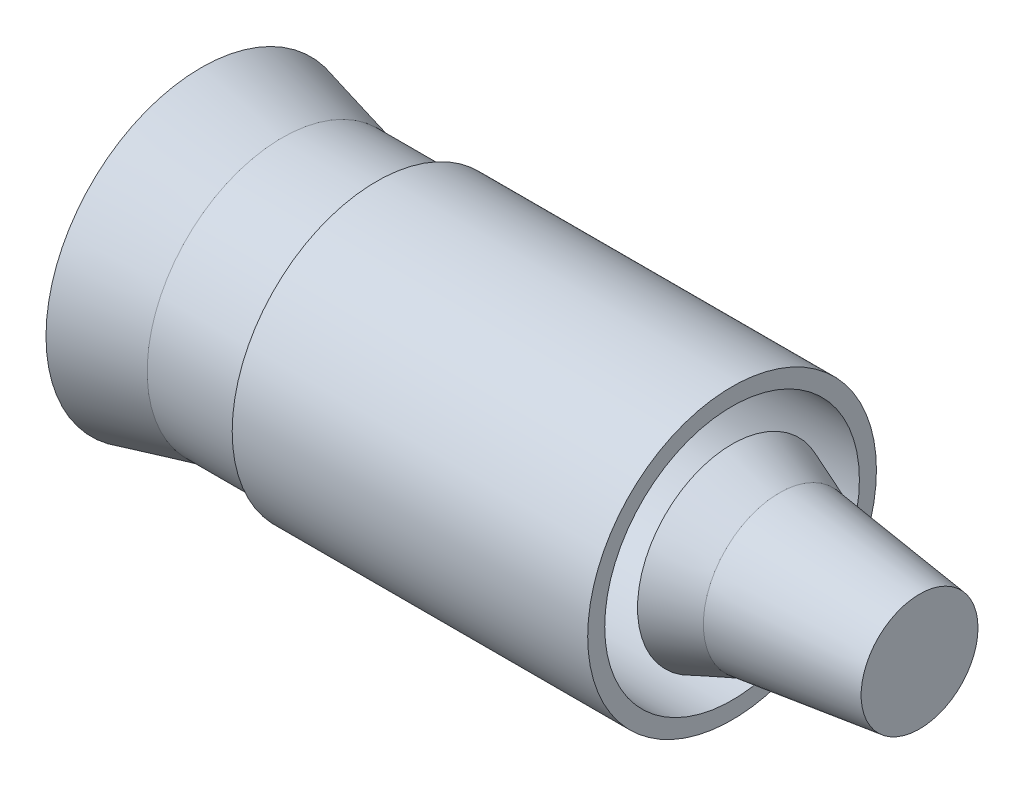
ISO-10303-21;
HEADER;
FILE_DESCRIPTION(('STEP AP214'),'2;1');
FILE_NAME('part.step','',(''),(''),'','','');
FILE_SCHEMA(('AUTOMOTIVE_DESIGN { 1 0 10303 214 1 1 1 1 }'));
ENDSEC;
DATA;
#1=APPLICATION_CONTEXT('core data for automotive mechanical design processes');
#2=APPLICATION_PROTOCOL_DEFINITION('international standard','automotive_design',2000,#1);
#3=PRODUCT_CONTEXT('',#1,'mechanical');
#4=PRODUCT('Part','Part','',(#3));
#5=PRODUCT_RELATED_PRODUCT_CATEGORY('part','',(#4));
#6=PRODUCT_DEFINITION_FORMATION('','',#4);
#7=PRODUCT_DEFINITION_CONTEXT('part definition',#1,'design');
#8=PRODUCT_DEFINITION('design','',#6,#7);
#9=PRODUCT_DEFINITION_SHAPE('','',#8);
#10=(LENGTH_UNIT() NAMED_UNIT(*) SI_UNIT(.MILLI.,.METRE.));
#11=(NAMED_UNIT(*) PLANE_ANGLE_UNIT() SI_UNIT($,.RADIAN.));
#12=(NAMED_UNIT(*) SI_UNIT($,.STERADIAN.) SOLID_ANGLE_UNIT());
#13=UNCERTAINTY_MEASURE_WITH_UNIT(LENGTH_MEASURE(1.E-05),#10,'distance_accuracy_value','');
#14=(GEOMETRIC_REPRESENTATION_CONTEXT(3) GLOBAL_UNCERTAINTY_ASSIGNED_CONTEXT((#13)) GLOBAL_UNIT_ASSIGNED_CONTEXT((#10,
#11,#12)) REPRESENTATION_CONTEXT('',''));
#15=CARTESIAN_POINT('',(0.,0.,0.));
#16=DIRECTION('',(0.,0.,1.));
#17=DIRECTION('',(1.,0.,0.));
#18=AXIS2_PLACEMENT_3D('',#15,#16,#17);
#19=CARTESIAN_POINT('',(0.,0.,0.));
#20=DIRECTION('',(1.,0.,0.));
#21=DIRECTION('',(0.,0.,1.));
#22=AXIS2_PLACEMENT_3D('',#19,#20,#21);
#23=PLANE('',#22);
#24=CARTESIAN_POINT('',(0.,0.,0.));
#25=DIRECTION('',(1.,0.,0.));
#26=DIRECTION('',(0.,0.,-1.));
#27=AXIS2_PLACEMENT_3D('',#24,#25,#26);
#28=CIRCLE('',#27,51.469115249051);
#29=CARTESIAN_POINT('',(0.,0.,-51.46911524905));
#30=VERTEX_POINT('',#29);
#31=EDGE_CURVE('P0_E11',#30,#30,#28,.T.);
#32=ORIENTED_EDGE('',*,*,#31,.F.);
#33=EDGE_LOOP('',(#32));
#34=FACE_BOUND('',#33,.T.);
#35=ADVANCED_FACE('P0_F17',(#34),#23,.F.);
#36=CARTESIAN_POINT('',(26.853451434288,0.,0.));
#37=DIRECTION('',(1.,0.,0.));
#38=DIRECTION('',(0.,0.,1.));
#39=AXIS2_PLACEMENT_3D('',#36,#37,#38);
#40=PLANE('',#39);
#41=CARTESIAN_POINT('',(26.853451434288,0.,0.));
#42=DIRECTION('',(1.,0.,0.));
#43=DIRECTION('',(0.,0.,-1.));
#44=AXIS2_PLACEMENT_3D('',#41,#42,#43);
#45=CIRCLE('',#44,44.755752390479);
#46=CARTESIAN_POINT('',(26.853451434288,0.,-44.75575239047));
#47=VERTEX_POINT('',#46);
#48=EDGE_CURVE('P0_E41',#47,#47,#45,.T.);
#49=ORIENTED_EDGE('',*,*,#48,.T.);
#50=EDGE_LOOP('',(#49));
#51=FACE_BOUND('',#50,.T.);
#52=ADVANCED_FACE('P0_F44',(#51),#40,.T.);
#53=CARTESIAN_POINT('',(0.,0.,0.));
#54=DIRECTION('',(-1.,0.,0.));
#55=DIRECTION('',(0.,0.,-1.));
#56=AXIS2_PLACEMENT_3D('',#53,#54,#55);
#57=CONICAL_SURFACE('',#56,51.469115249051,0.244978663127);
#58=ORIENTED_EDGE('',*,*,#48,.F.);
#59=DIRECTION('',(0.970142500145391,0.,0.242535625036098));
#60=VECTOR('',#59,1.);
#61=CARTESIAN_POINT('',(0.,0.,-51.46911524905));
#62=LINE('',#61,#60);
#63=EDGE_CURVE('P0_E25',#30,#47,#62,.T.);
#64=ORIENTED_EDGE('',*,*,#63,.F.);
#65=ORIENTED_EDGE('',*,*,#31,.T.);
#66=ORIENTED_EDGE('',*,*,#63,.T.);
#67=EDGE_LOOP('',(#58,#64,#65,#66));
#68=FACE_BOUND('',#67,.T.);
#69=ADVANCED_FACE('P0_F40',(#68),#57,.T.);
#70=CLOSED_SHELL('',(#35,#52,#69));
#71=MANIFOLD_SOLID_BREP('P0_B1',#70);
#72=CARTESIAN_POINT('',(26.853451434288,0.,0.));
#73=DIRECTION('',(1.,0.,0.));
#74=DIRECTION('',(0.,0.,1.));
#75=AXIS2_PLACEMENT_3D('',#72,#73,#74);
#76=PLANE('',#75);
#77=CARTESIAN_POINT('',(26.853451434288,0.,0.));
#78=DIRECTION('',(1.,0.,0.));
#79=DIRECTION('',(0.,0.,-1.));
#80=AXIS2_PLACEMENT_3D('',#77,#78,#79);
#81=CIRCLE('',#80,44.755752390479);
#82=CARTESIAN_POINT('',(26.853451434288,0.,-44.75575239047));
#83=VERTEX_POINT('',#82);
#84=EDGE_CURVE('P1_E11',#83,#83,#81,.T.);
#85=ORIENTED_EDGE('',*,*,#84,.F.);
#86=EDGE_LOOP('',(#85));
#87=FACE_BOUND('',#86,.T.);
#88=ADVANCED_FACE('P1_F17',(#87),#76,.F.);
#89=CARTESIAN_POINT('',(58.182478107623,0.,0.));
#90=DIRECTION('',(1.,0.,0.));
#91=DIRECTION('',(0.,0.,1.));
#92=AXIS2_PLACEMENT_3D('',#89,#90,#91);
#93=PLANE('',#92);
#94=CARTESIAN_POINT('',(58.182478107623,0.,0.));
#95=DIRECTION('',(1.,0.,0.));
#96=DIRECTION('',(0.,0.,-1.));
#97=AXIS2_PLACEMENT_3D('',#94,#95,#96);
#98=CIRCLE('',#97,44.755752390479);
#99=CARTESIAN_POINT('',(58.182478107623,0.,-44.75575239047));
#100=VERTEX_POINT('',#99);
#101=EDGE_CURVE('P1_E41',#100,#100,#98,.T.);
#102=ORIENTED_EDGE('',*,*,#101,.T.);
#103=EDGE_LOOP('',(#102));
#104=FACE_BOUND('',#103,.T.);
#105=ADVANCED_FACE('P1_F44',(#104),#93,.T.);
#106=CARTESIAN_POINT('',(26.853451434288,0.,0.));
#107=DIRECTION('',(1.,0.,0.));
#108=DIRECTION('',(0.,0.,-1.));
#109=AXIS2_PLACEMENT_3D('',#106,#107,#108);
#110=CYLINDRICAL_SURFACE('',#109,44.755752390479);
#111=ORIENTED_EDGE('',*,*,#101,.F.);
#112=DIRECTION('',(1.,0.,0.));
#113=VECTOR('',#112,1.);
#114=CARTESIAN_POINT('',(26.853451434288,0.,-44.75575239047));
#115=LINE('',#114,#113);
#116=EDGE_CURVE('P1_E25',#83,#100,#115,.T.);
#117=ORIENTED_EDGE('',*,*,#116,.F.);
#118=ORIENTED_EDGE('',*,*,#84,.T.);
#119=ORIENTED_EDGE('',*,*,#116,.T.);
#120=EDGE_LOOP('',(#111,#117,#118,#119));
#121=FACE_BOUND('',#120,.T.);
#122=ADVANCED_FACE('P1_F40',(#121),#110,.T.);
#123=CLOSED_SHELL('',(#88,#105,#122));
#124=MANIFOLD_SOLID_BREP('P1_B1',#123);
#125=CARTESIAN_POINT('',(58.182478107623,0.,0.));
#126=DIRECTION('',(1.,0.,0.));
#127=DIRECTION('',(0.,0.,-1.));
#128=AXIS2_PLACEMENT_3D('',#125,#126,#127);
#129=CYLINDRICAL_SURFACE('',#128,42.239244781118);
#130=DIRECTION('',(1.,0.,0.));
#131=VECTOR('',#130,1.);
#132=CARTESIAN_POINT('',(58.182478107623,0.,-42.23924478111));
#133=LINE('',#132,#131);
#134=CARTESIAN_POINT('',(58.182478107623,0.,-42.23924478111));
#135=VERTEX_POINT('',#134);
#136=CARTESIAN_POINT('',(176.104446713,0.,-42.23924478111));
#137=VERTEX_POINT('',#136);
#138=EDGE_CURVE('P2_E11',#135,#137,#133,.T.);
#139=ORIENTED_EDGE('',*,*,#138,.F.);
#140=CARTESIAN_POINT('',(58.182478107623,0.,0.));
#141=DIRECTION('',(1.,0.,0.));
#142=DIRECTION('',(0.,0.,-1.));
#143=AXIS2_PLACEMENT_3D('',#140,#141,#142);
#144=CIRCLE('',#143,42.239244781118);
#145=EDGE_CURVE('P2_E25',#135,#135,#144,.T.);
#146=ORIENTED_EDGE('',*,*,#145,.F.);
#147=ORIENTED_EDGE('',*,*,#138,.T.);
#148=CARTESIAN_POINT('',(176.104446713,0.,0.));
#149=DIRECTION('',(1.,0.,0.));
#150=DIRECTION('',(0.,0.,-1.));
#151=AXIS2_PLACEMENT_3D('',#148,#149,#150);
#152=CIRCLE('',#151,42.239244781118);
#153=EDGE_CURVE('P2_E67',#137,#137,#152,.T.);
#154=ORIENTED_EDGE('',*,*,#153,.T.);
#155=EDGE_LOOP('',(#139,#146,#147,#154));
#156=FACE_BOUND('',#155,.T.);
#157=ADVANCED_FACE('P2_F17',(#156),#129,.F.);
#158=CARTESIAN_POINT('',(58.182478107623,0.,0.));
#159=DIRECTION('',(1.,0.,0.));
#160=DIRECTION('',(0.,0.,1.));
#161=AXIS2_PLACEMENT_3D('',#158,#159,#160);
#162=PLANE('',#161);
#163=ORIENTED_EDGE('',*,*,#145,.T.);
#164=EDGE_LOOP('',(#163));
#165=FACE_BOUND('',#164,.T.);
#166=CARTESIAN_POINT('',(58.182478107623,0.,0.));
#167=DIRECTION('',(1.,0.,0.));
#168=DIRECTION('',(0.,0.,-1.));
#169=AXIS2_PLACEMENT_3D('',#166,#167,#168);
#170=CIRCLE('',#169,47.889436157621);
#171=CARTESIAN_POINT('',(58.182478107623,0.,-47.88943615762));
#172=VERTEX_POINT('',#171);
#173=EDGE_CURVE('P2_E56',#172,#172,#170,.T.);
#174=ORIENTED_EDGE('',*,*,#173,.F.);
#175=EDGE_LOOP('',(#174));
#176=FACE_BOUND('',#175,.T.);
#177=ADVANCED_FACE('P2_F72',(#165,#176),#162,.F.);
#178=CARTESIAN_POINT('',(176.104446713,0.,0.));
#179=DIRECTION('',(1.,0.,0.));
#180=DIRECTION('',(0.,0.,1.));
#181=AXIS2_PLACEMENT_3D('',#178,#179,#180);
#182=PLANE('',#181);
#183=ORIENTED_EDGE('',*,*,#153,.F.);
#184=EDGE_LOOP('',(#183));
#185=FACE_BOUND('',#184,.T.);
#186=CARTESIAN_POINT('',(176.104446713,0.,0.));
#187=DIRECTION('',(1.,0.,0.));
#188=DIRECTION('',(0.,0.,-1.));
#189=AXIS2_PLACEMENT_3D('',#186,#187,#188);
#190=CIRCLE('',#189,47.889436157621);
#191=CARTESIAN_POINT('',(176.104446713,0.,-47.88943615762));
#192=VERTEX_POINT('',#191);
#193=EDGE_CURVE('P2_E54',#192,#192,#190,.T.);
#194=ORIENTED_EDGE('',*,*,#193,.T.);
#195=EDGE_LOOP('',(#194));
#196=FACE_BOUND('',#195,.T.);
#197=ADVANCED_FACE('P2_F60',(#185,#196),#182,.T.);
#198=CARTESIAN_POINT('',(58.182478107623,0.,0.));
#199=DIRECTION('',(1.,0.,0.));
#200=DIRECTION('',(0.,0.,-1.));
#201=AXIS2_PLACEMENT_3D('',#198,#199,#200);
#202=CYLINDRICAL_SURFACE('',#201,47.889436157621);
#203=ORIENTED_EDGE('',*,*,#193,.F.);
#204=DIRECTION('',(1.,0.,0.));
#205=VECTOR('',#204,1.);
#206=CARTESIAN_POINT('',(58.182478107623,0.,-47.88943615762));
#207=LINE('',#206,#205);
#208=EDGE_CURVE('P2_E51',#172,#192,#207,.T.);
#209=ORIENTED_EDGE('',*,*,#208,.F.);
#210=ORIENTED_EDGE('',*,*,#173,.T.);
#211=ORIENTED_EDGE('',*,*,#208,.T.);
#212=EDGE_LOOP('',(#203,#209,#210,#211));
#213=FACE_BOUND('',#212,.T.);
#214=ADVANCED_FACE('P2_F53',(#213),#202,.T.);
#215=CLOSED_SHELL('',(#157,#177,#197,#214));
#216=MANIFOLD_SOLID_BREP('P2_B1',#215);
#217=CARTESIAN_POINT('',(176.104446713,0.,0.));
#218=DIRECTION('',(1.,0.,0.));
#219=DIRECTION('',(0.,0.,1.));
#220=AXIS2_PLACEMENT_3D('',#217,#218,#219);
#221=PLANE('',#220);
#222=CARTESIAN_POINT('',(176.104446713,0.,0.));
#223=DIRECTION('',(1.,0.,0.));
#224=DIRECTION('',(0.,0.,-1.));
#225=AXIS2_PLACEMENT_3D('',#222,#223,#224);
#226=CIRCLE('',#225,31.361731279946);
#227=CARTESIAN_POINT('',(176.104446713,0.,-31.36173127994));
#228=VERTEX_POINT('',#227);
#229=EDGE_CURVE('P3_E11',#228,#228,#226,.T.);
#230=ORIENTED_EDGE('',*,*,#229,.F.);
#231=EDGE_LOOP('',(#230));
#232=FACE_BOUND('',#231,.T.);
#233=ADVANCED_FACE('P3_F17',(#232),#221,.F.);
#234=CARTESIAN_POINT('',(191.78531235298,0.,0.));
#235=DIRECTION('',(1.,0.,0.));
#236=DIRECTION('',(0.,0.,1.));
#237=AXIS2_PLACEMENT_3D('',#234,#235,#236);
#238=PLANE('',#237);
#239=CARTESIAN_POINT('',(191.78531235298,0.,0.));
#240=DIRECTION('',(1.,0.,0.));
#241=DIRECTION('',(0.,0.,-1.));
#242=AXIS2_PLACEMENT_3D('',#239,#240,#241);
#243=CIRCLE('',#242,25.196999479031);
#244=CARTESIAN_POINT('',(191.78531235298,0.,-25.19699947903));
#245=VERTEX_POINT('',#244);
#246=EDGE_CURVE('P3_E41',#245,#245,#243,.T.);
#247=ORIENTED_EDGE('',*,*,#246,.T.);
#248=EDGE_LOOP('',(#247));
#249=FACE_BOUND('',#248,.T.);
#250=ADVANCED_FACE('P3_F44',(#249),#238,.T.);
#251=CARTESIAN_POINT('',(176.104446713,0.,0.));
#252=DIRECTION('',(-1.,0.,0.));
#253=DIRECTION('',(0.,0.,-1.));
#254=AXIS2_PLACEMENT_3D('',#251,#252,#253);
#255=CONICAL_SURFACE('',#254,31.361731279946,0.374576216394);
#256=ORIENTED_EDGE('',*,*,#246,.F.);
#257=DIRECTION('',(0.930662758644584,0.,0.365878162332836));
#258=VECTOR('',#257,1.);
#259=CARTESIAN_POINT('',(176.104446713,0.,-31.36173127994));
#260=LINE('',#259,#258);
#261=EDGE_CURVE('P3_E25',#228,#245,#260,.T.);
#262=ORIENTED_EDGE('',*,*,#261,.F.);
#263=ORIENTED_EDGE('',*,*,#229,.T.);
#264=ORIENTED_EDGE('',*,*,#261,.T.);
#265=EDGE_LOOP('',(#256,#262,#263,#264));
#266=FACE_BOUND('',#265,.T.);
#267=ADVANCED_FACE('P3_F40',(#266),#255,.T.);
#268=CLOSED_SHELL('',(#233,#250,#267));
#269=MANIFOLD_SOLID_BREP('P3_B1',#268);
#270=CARTESIAN_POINT('',(191.78531235298,0.,0.));
#271=DIRECTION('',(1.,0.,0.));
#272=DIRECTION('',(0.,0.,1.));
#273=AXIS2_PLACEMENT_3D('',#270,#271,#272);
#274=PLANE('',#273);
#275=CARTESIAN_POINT('',(191.78531235298,0.,0.));
#276=DIRECTION('',(1.,0.,0.));
#277=DIRECTION('',(0.,0.,-1.));
#278=AXIS2_PLACEMENT_3D('',#275,#276,#277);
#279=CIRCLE('',#278,25.196999479031);
#280=CARTESIAN_POINT('',(191.78531235298,0.,-25.19699947903));
#281=VERTEX_POINT('',#280);
#282=EDGE_CURVE('P4_E10',#281,#281,#279,.T.);
#283=ORIENTED_EDGE('',*,*,#282,.F.);
#284=EDGE_LOOP('',(#283));
#285=FACE_BOUND('',#284,.T.);
#286=ADVANCED_FACE('P4_F16',(#285),#274,.F.);
#287=CARTESIAN_POINT('',(238.30284985273,0.,0.));
#288=DIRECTION('',(1.,0.,0.));
#289=DIRECTION('',(0.,0.,1.));
#290=AXIS2_PLACEMENT_3D('',#287,#288,#289);
#291=PLANE('',#290);
#292=CARTESIAN_POINT('',(238.30284985273,0.,0.));
#293=DIRECTION('',(1.,0.,0.));
#294=DIRECTION('',(0.,0.,-1.));
#295=AXIS2_PLACEMENT_3D('',#292,#293,#294);
#296=CIRCLE('',#295,19.382307291563);
#297=CARTESIAN_POINT('',(238.30284985273,0.,-19.38230729156));
#298=VERTEX_POINT('',#297);
#299=EDGE_CURVE('P4_E40',#298,#298,#296,.T.);
#300=ORIENTED_EDGE('',*,*,#299,.T.);
#301=EDGE_LOOP('',(#300));
#302=FACE_BOUND('',#301,.T.);
#303=ADVANCED_FACE('P4_F43',(#302),#291,.T.);
#304=CARTESIAN_POINT('',(191.78531235298,0.,0.));
#305=DIRECTION('',(-1.,0.,0.));
#306=DIRECTION('',(0.,0.,-1.));
#307=AXIS2_PLACEMENT_3D('',#304,#305,#306);
#308=CONICAL_SURFACE('',#307,25.196999479031,0.124354994547);
#309=ORIENTED_EDGE('',*,*,#299,.F.);
#310=DIRECTION('',(0.992277876713698,0.,0.124034734588962));
#311=VECTOR('',#310,1.);
#312=CARTESIAN_POINT('',(191.78531235298,0.,-25.19699947903));
#313=LINE('',#312,#311);
#314=EDGE_CURVE('P4_E24',#281,#298,#313,.T.);
#315=ORIENTED_EDGE('',*,*,#314,.F.);
#316=ORIENTED_EDGE('',*,*,#282,.T.);
#317=ORIENTED_EDGE('',*,*,#314,.T.);
#318=EDGE_LOOP('',(#309,#315,#316,#317));
#319=FACE_BOUND('',#318,.T.);
#320=ADVANCED_FACE('P4_F39',(#319),#308,.T.);
#321=CLOSED_SHELL('',(#286,#303,#320));
#322=MANIFOLD_SOLID_BREP('P4_B1',#321);
#323=ADVANCED_BREP_SHAPE_REPRESENTATION('',(#18,#71,#124,#216,#269,#322),#14);
#324=SHAPE_DEFINITION_REPRESENTATION(#9,#323);
ENDSEC;
END-ISO-10303-21;
